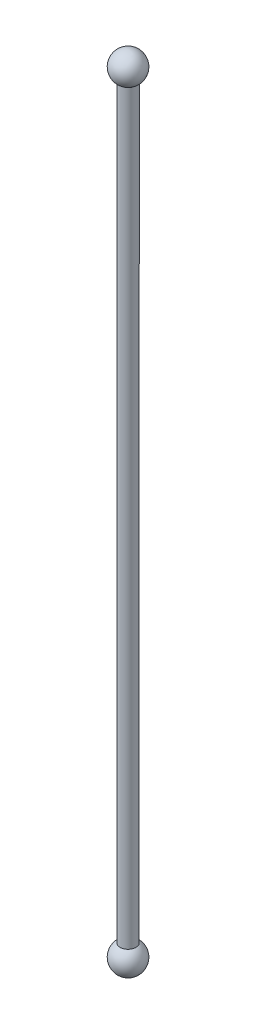
ISO-10303-21;
HEADER;
FILE_DESCRIPTION(('STEP AP214'),'2;1');
FILE_NAME('part.step','',(''),(''),'','','');
FILE_SCHEMA(('AUTOMOTIVE_DESIGN { 1 0 10303 214 1 1 1 1 }'));
ENDSEC;
DATA;
#1=APPLICATION_CONTEXT('core data for automotive mechanical design processes');
#2=APPLICATION_PROTOCOL_DEFINITION('international standard','automotive_design',2000,#1);
#3=PRODUCT_CONTEXT('',#1,'mechanical');
#4=PRODUCT('Part','Part','',(#3));
#5=PRODUCT_RELATED_PRODUCT_CATEGORY('part','',(#4));
#6=PRODUCT_DEFINITION_FORMATION('','',#4);
#7=PRODUCT_DEFINITION_CONTEXT('part definition',#1,'design');
#8=PRODUCT_DEFINITION('design','',#6,#7);
#9=PRODUCT_DEFINITION_SHAPE('','',#8);
#10=(LENGTH_UNIT() NAMED_UNIT(*) SI_UNIT(.MILLI.,.METRE.));
#11=(NAMED_UNIT(*) PLANE_ANGLE_UNIT() SI_UNIT($,.RADIAN.));
#12=(NAMED_UNIT(*) SI_UNIT($,.STERADIAN.) SOLID_ANGLE_UNIT());
#13=UNCERTAINTY_MEASURE_WITH_UNIT(LENGTH_MEASURE(1.E-05),#10,'distance_accuracy_value','');
#14=(GEOMETRIC_REPRESENTATION_CONTEXT(3) GLOBAL_UNCERTAINTY_ASSIGNED_CONTEXT((#13)) GLOBAL_UNIT_ASSIGNED_CONTEXT((#10,
#11,#12)) REPRESENTATION_CONTEXT('',''));
#15=CARTESIAN_POINT('',(0.,0.,0.));
#16=DIRECTION('',(0.,0.,1.));
#17=DIRECTION('',(1.,0.,0.));
#18=AXIS2_PLACEMENT_3D('',#15,#16,#17);
#19=CARTESIAN_POINT('',(0.,0.,0.));
#20=DIRECTION('',(1.,0.,0.));
#21=DIRECTION('',(0.,-1.,0.));
#22=AXIS2_PLACEMENT_3D('',#19,#20,#21);
#23=SPHERICAL_SURFACE('',#22,2.25);
#24=CARTESIAN_POINT('',(-1.4142135623731,0.,0.));
#25=DIRECTION('',(-1.,0.,0.));
#26=DIRECTION('',(0.,1.,0.));
#27=AXIS2_PLACEMENT_3D('',#24,#25,#26);
#28=CIRCLE('',#27,1.75);
#29=CARTESIAN_POINT('',(-1.4142135623731,-1.75,0.));
#30=VERTEX_POINT('',#29);
#31=CARTESIAN_POINT('',(-1.4142135623731,1.75,0.));
#32=VERTEX_POINT('',#31);
#33=EDGE_CURVE('E126',#30,#32,#28,.T.);
#34=ORIENTED_EDGE('',*,*,#33,.T.);
#35=CARTESIAN_POINT('',(0.,0.,0.));
#36=DIRECTION('',(0.,0.,-1.));
#37=DIRECTION('',(0.,1.,0.));
#38=AXIS2_PLACEMENT_3D('',#35,#36,#37);
#39=CIRCLE('',#38,2.25);
#40=CARTESIAN_POINT('',(2.25,0.,0.));
#41=VERTEX_POINT('',#40);
#42=EDGE_CURVE('E10',#32,#41,#39,.T.);
#43=ORIENTED_EDGE('',*,*,#42,.T.);
#44=ORIENTED_EDGE('',*,*,#42,.F.);
#45=CARTESIAN_POINT('',(-1.4142135623731,0.,0.));
#46=DIRECTION('',(-1.,0.,0.));
#47=DIRECTION('',(0.,1.,0.));
#48=AXIS2_PLACEMENT_3D('',#45,#46,#47);
#49=CIRCLE('',#48,1.75);
#50=EDGE_CURVE('E116',#32,#30,#49,.T.);
#51=ORIENTED_EDGE('',*,*,#50,.T.);
#52=EDGE_LOOP('',(#34,#43,#44,#51));
#53=FACE_BOUND('',#52,.T.);
#54=ADVANCED_FACE('F16',(#53),#23,.F.);
#55=CARTESIAN_POINT('',(0.,170.,0.));
#56=DIRECTION('',(1.,0.,0.));
#57=DIRECTION('',(0.,-1.,0.));
#58=AXIS2_PLACEMENT_3D('',#55,#56,#57);
#59=SPHERICAL_SURFACE('',#58,2.25);
#60=CARTESIAN_POINT('',(-1.41421356237309,170.,0.));
#61=DIRECTION('',(-1.,0.,0.));
#62=DIRECTION('',(0.,1.,0.));
#63=AXIS2_PLACEMENT_3D('',#60,#61,#62);
#64=CIRCLE('',#63,1.75);
#65=CARTESIAN_POINT('',(-1.41421356237309,168.25,0.));
#66=VERTEX_POINT('',#65);
#67=CARTESIAN_POINT('',(-1.41421356237309,171.75,0.));
#68=VERTEX_POINT('',#67);
#69=EDGE_CURVE('E305',#66,#68,#64,.T.);
#70=ORIENTED_EDGE('',*,*,#69,.T.);
#71=CARTESIAN_POINT('',(0.,170.,0.));
#72=DIRECTION('',(0.,0.,-1.));
#73=DIRECTION('',(0.,1.,0.));
#74=AXIS2_PLACEMENT_3D('',#71,#72,#73);
#75=CIRCLE('',#74,2.25);
#76=CARTESIAN_POINT('',(2.25,170.,0.));
#77=VERTEX_POINT('',#76);
#78=EDGE_CURVE('E19',#68,#77,#75,.T.);
#79=ORIENTED_EDGE('',*,*,#78,.T.);
#80=ORIENTED_EDGE('',*,*,#78,.F.);
#81=CARTESIAN_POINT('',(-1.41421356237309,170.,0.));
#82=DIRECTION('',(-1.,0.,0.));
#83=DIRECTION('',(0.,1.,0.));
#84=AXIS2_PLACEMENT_3D('',#81,#82,#83);
#85=CIRCLE('',#84,1.75);
#86=EDGE_CURVE('E244',#68,#66,#85,.T.);
#87=ORIENTED_EDGE('',*,*,#86,.T.);
#88=EDGE_LOOP('',(#70,#79,#80,#87));
#89=FACE_BOUND('',#88,.T.);
#90=ADVANCED_FACE('F202',(#89),#59,.F.);
#91=CARTESIAN_POINT('',(0.,170.,0.));
#92=DIRECTION('',(-1.,0.,0.));
#93=DIRECTION('',(0.,-1.,0.));
#94=AXIS2_PLACEMENT_3D('',#91,#92,#93);
#95=SPHERICAL_SURFACE('',#94,3.25);
#96=CARTESIAN_POINT('',(0.,167.261387212474,0.));
#97=DIRECTION('',(0.,1.,0.));
#98=DIRECTION('',(0.,0.,1.));
#99=AXIS2_PLACEMENT_3D('',#96,#97,#98);
#100=CIRCLE('',#99,1.75);
#101=CARTESIAN_POINT('',(0.,167.261387212474,-1.75));
#102=VERTEX_POINT('',#101);
#103=EDGE_CURVE('E139',#102,#102,#100,.T.);
#104=ORIENTED_EDGE('',*,*,#103,.T.);
#105=EDGE_LOOP('',(#104));
#106=FACE_BOUND('',#105,.T.);
#107=CARTESIAN_POINT('',(-2.73861278752583,170.,0.));
#108=DIRECTION('',(1.,0.,0.));
#109=DIRECTION('',(0.,1.,0.));
#110=AXIS2_PLACEMENT_3D('',#107,#108,#109);
#111=CIRCLE('',#110,1.75);
#112=CARTESIAN_POINT('',(-2.73861278752583,168.25,0.));
#113=VERTEX_POINT('',#112);
#114=CARTESIAN_POINT('',(-2.73861278752583,171.75,0.));
#115=VERTEX_POINT('',#114);
#116=EDGE_CURVE('E248',#113,#115,#111,.T.);
#117=ORIENTED_EDGE('',*,*,#116,.T.);
#118=CARTESIAN_POINT('',(0.,170.,0.));
#119=DIRECTION('',(0.,0.,-1.));
#120=DIRECTION('',(0.,1.,0.));
#121=AXIS2_PLACEMENT_3D('',#118,#119,#120);
#122=CIRCLE('',#121,3.25);
#123=CARTESIAN_POINT('',(3.25,170.,0.));
#124=VERTEX_POINT('',#123);
#125=EDGE_CURVE('E144',#115,#124,#122,.T.);
#126=ORIENTED_EDGE('',*,*,#125,.T.);
#127=ORIENTED_EDGE('',*,*,#125,.F.);
#128=CARTESIAN_POINT('',(-2.73861278752583,170.,0.));
#129=DIRECTION('',(1.,0.,0.));
#130=DIRECTION('',(0.,1.,0.));
#131=AXIS2_PLACEMENT_3D('',#128,#129,#130);
#132=CIRCLE('',#131,1.75);
#133=EDGE_CURVE('E254',#115,#113,#132,.T.);
#134=ORIENTED_EDGE('',*,*,#133,.T.);
#135=EDGE_LOOP('',(#117,#126,#127,#134));
#136=FACE_BOUND('',#135,.T.);
#137=ADVANCED_FACE('F198',(#106,#136),#95,.T.);
#138=CARTESIAN_POINT('',(0.,0.,0.));
#139=DIRECTION('',(-1.,0.,0.));
#140=DIRECTION('',(0.,-1.,0.));
#141=AXIS2_PLACEMENT_3D('',#138,#139,#140);
#142=SPHERICAL_SURFACE('',#141,3.25);
#143=CARTESIAN_POINT('',(-2.73861278752583,0.,0.));
#144=DIRECTION('',(1.,0.,0.));
#145=DIRECTION('',(0.,1.,0.));
#146=AXIS2_PLACEMENT_3D('',#143,#144,#145);
#147=CIRCLE('',#146,1.75);
#148=CARTESIAN_POINT('',(-2.73861278752583,-1.75,0.));
#149=VERTEX_POINT('',#148);
#150=CARTESIAN_POINT('',(-2.73861278752583,1.75,0.));
#151=VERTEX_POINT('',#150);
#152=EDGE_CURVE('E115',#149,#151,#147,.T.);
#153=ORIENTED_EDGE('',*,*,#152,.T.);
#154=CARTESIAN_POINT('',(0.,0.,0.));
#155=DIRECTION('',(0.,0.,-1.));
#156=DIRECTION('',(0.,1.,0.));
#157=AXIS2_PLACEMENT_3D('',#154,#155,#156);
#158=CIRCLE('',#157,3.25);
#159=CARTESIAN_POINT('',(-1.75,2.73861278752584,0.));
#160=VERTEX_POINT('',#159);
#161=EDGE_CURVE('E97',#151,#160,#158,.T.);
#162=ORIENTED_EDGE('',*,*,#161,.T.);
#163=CARTESIAN_POINT('',(0.,2.73861278752584,0.));
#164=DIRECTION('',(0.,-1.,0.));
#165=DIRECTION('',(0.,0.,1.));
#166=AXIS2_PLACEMENT_3D('',#163,#164,#165);
#167=CIRCLE('',#166,1.75);
#168=CARTESIAN_POINT('',(0.,2.73861278752584,-1.75));
#169=VERTEX_POINT('',#168);
#170=EDGE_CURVE('E109',#160,#169,#167,.T.);
#171=ORIENTED_EDGE('',*,*,#170,.T.);
#172=CARTESIAN_POINT('',(0.,2.73861278752584,0.));
#173=DIRECTION('',(0.,-1.,0.));
#174=DIRECTION('',(0.,0.,1.));
#175=AXIS2_PLACEMENT_3D('',#172,#173,#174);
#176=CIRCLE('',#175,1.75);
#177=CARTESIAN_POINT('',(1.75,2.73861278752584,0.));
#178=VERTEX_POINT('',#177);
#179=EDGE_CURVE('E131',#169,#178,#176,.T.);
#180=ORIENTED_EDGE('',*,*,#179,.T.);
#181=CARTESIAN_POINT('',(0.,0.,0.));
#182=DIRECTION('',(0.,0.,-1.));
#183=DIRECTION('',(0.,1.,0.));
#184=AXIS2_PLACEMENT_3D('',#181,#182,#183);
#185=CIRCLE('',#184,3.25);
#186=CARTESIAN_POINT('',(3.25,0.,0.));
#187=VERTEX_POINT('',#186);
#188=EDGE_CURVE('E108',#178,#187,#185,.T.);
#189=ORIENTED_EDGE('',*,*,#188,.T.);
#190=ORIENTED_EDGE('',*,*,#188,.F.);
#191=CARTESIAN_POINT('',(0.,2.73861278752584,0.));
#192=DIRECTION('',(0.,-1.,0.));
#193=DIRECTION('',(0.,0.,1.));
#194=AXIS2_PLACEMENT_3D('',#191,#192,#193);
#195=CIRCLE('',#194,1.75);
#196=EDGE_CURVE('E106',#178,#160,#195,.T.);
#197=ORIENTED_EDGE('',*,*,#196,.T.);
#198=ORIENTED_EDGE('',*,*,#161,.F.);
#199=CARTESIAN_POINT('',(-2.73861278752583,0.,0.));
#200=DIRECTION('',(1.,0.,0.));
#201=DIRECTION('',(0.,1.,0.));
#202=AXIS2_PLACEMENT_3D('',#199,#200,#201);
#203=CIRCLE('',#202,1.75);
#204=EDGE_CURVE('E103',#151,#149,#203,.T.);
#205=ORIENTED_EDGE('',*,*,#204,.T.);
#206=EDGE_LOOP('',(#153,#162,#171,#180,#189,#190,#197,#198,#205));
#207=FACE_BOUND('',#206,.T.);
#208=ADVANCED_FACE('F101',(#207),#142,.T.);
#209=CARTESIAN_POINT('',(0.,85.,0.));
#210=DIRECTION('',(0.,-1.,0.));
#211=DIRECTION('',(0.,0.,1.));
#212=AXIS2_PLACEMENT_3D('',#209,#210,#211);
#213=CYLINDRICAL_SURFACE('',#212,1.75);
#214=ORIENTED_EDGE('',*,*,#196,.F.);
#215=ORIENTED_EDGE('',*,*,#179,.F.);
#216=DIRECTION('',(0.,1.,0.));
#217=VECTOR('',#216,1.);
#218=CARTESIAN_POINT('',(0.,85.,-1.75));
#219=LINE('',#218,#217);
#220=EDGE_CURVE('E133',#169,#102,#219,.T.);
#221=ORIENTED_EDGE('',*,*,#220,.T.);
#222=ORIENTED_EDGE('',*,*,#103,.F.);
#223=ORIENTED_EDGE('',*,*,#220,.F.);
#224=ORIENTED_EDGE('',*,*,#170,.F.);
#225=EDGE_LOOP('',(#214,#215,#221,#222,#223,#224));
#226=FACE_BOUND('',#225,.T.);
#227=ADVANCED_FACE('F177',(#226),#213,.T.);
#228=CARTESIAN_POINT('',(0.,0.,0.));
#229=DIRECTION('',(-1.,0.,0.));
#230=DIRECTION('',(0.,1.,0.));
#231=AXIS2_PLACEMENT_3D('',#228,#229,#230);
#232=CYLINDRICAL_SURFACE('',#231,1.75);
#233=ORIENTED_EDGE('',*,*,#33,.F.);
#234=DIRECTION('',(-1.,0.,0.));
#235=VECTOR('',#234,1.);
#236=CARTESIAN_POINT('',(0.,-1.75,0.));
#237=LINE('',#236,#235);
#238=EDGE_CURVE('E120',#30,#149,#237,.T.);
#239=ORIENTED_EDGE('',*,*,#238,.T.);
#240=ORIENTED_EDGE('',*,*,#204,.F.);
#241=ORIENTED_EDGE('',*,*,#152,.F.);
#242=ORIENTED_EDGE('',*,*,#238,.F.);
#243=ORIENTED_EDGE('',*,*,#50,.F.);
#244=EDGE_LOOP('',(#233,#239,#240,#241,#242,#243));
#245=FACE_BOUND('',#244,.T.);
#246=ADVANCED_FACE('F118',(#245),#232,.F.);
#247=CARTESIAN_POINT('',(0.,170.,0.));
#248=DIRECTION('',(-1.,0.,0.));
#249=DIRECTION('',(0.,1.,0.));
#250=AXIS2_PLACEMENT_3D('',#247,#248,#249);
#251=CYLINDRICAL_SURFACE('',#250,1.75);
#252=ORIENTED_EDGE('',*,*,#69,.F.);
#253=DIRECTION('',(-1.,0.,0.));
#254=VECTOR('',#253,1.);
#255=CARTESIAN_POINT('',(0.,168.25,0.));
#256=LINE('',#255,#254);
#257=EDGE_CURVE('E255',#66,#113,#256,.T.);
#258=ORIENTED_EDGE('',*,*,#257,.T.);
#259=ORIENTED_EDGE('',*,*,#133,.F.);
#260=ORIENTED_EDGE('',*,*,#116,.F.);
#261=ORIENTED_EDGE('',*,*,#257,.F.);
#262=ORIENTED_EDGE('',*,*,#86,.F.);
#263=EDGE_LOOP('',(#252,#258,#259,#260,#261,#262));
#264=FACE_BOUND('',#263,.T.);
#265=ADVANCED_FACE('F162',(#264),#251,.F.);
#266=CLOSED_SHELL('',(#54,#90,#137,#208,#227,#246,#265));
#267=MANIFOLD_SOLID_BREP('B1',#266);
#268=ADVANCED_BREP_SHAPE_REPRESENTATION('',(#18,#267),#14);
#269=SHAPE_DEFINITION_REPRESENTATION(#9,#268);
ENDSEC;
END-ISO-10303-21;
